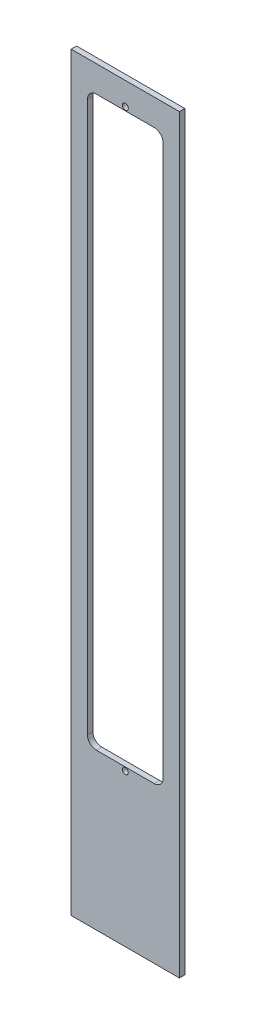
ISO-10303-21;
HEADER;
FILE_DESCRIPTION(('STEP AP214'),'2;1');
FILE_NAME('part.step','',(''),(''),'','','');
FILE_SCHEMA(('AUTOMOTIVE_DESIGN { 1 0 10303 214 1 1 1 1 }'));
ENDSEC;
DATA;
#1=APPLICATION_CONTEXT('core data for automotive mechanical design processes');
#2=APPLICATION_PROTOCOL_DEFINITION('international standard','automotive_design',2000,#1);
#3=PRODUCT_CONTEXT('',#1,'mechanical');
#4=PRODUCT('Part','Part','',(#3));
#5=PRODUCT_RELATED_PRODUCT_CATEGORY('part','',(#4));
#6=PRODUCT_DEFINITION_FORMATION('','',#4);
#7=PRODUCT_DEFINITION_CONTEXT('part definition',#1,'design');
#8=PRODUCT_DEFINITION('design','',#6,#7);
#9=PRODUCT_DEFINITION_SHAPE('','',#8);
#10=(LENGTH_UNIT() NAMED_UNIT(*) SI_UNIT(.MILLI.,.METRE.));
#11=(NAMED_UNIT(*) PLANE_ANGLE_UNIT() SI_UNIT($,.RADIAN.));
#12=(NAMED_UNIT(*) SI_UNIT($,.STERADIAN.) SOLID_ANGLE_UNIT());
#13=UNCERTAINTY_MEASURE_WITH_UNIT(LENGTH_MEASURE(1.E-05),#10,'distance_accuracy_value','');
#14=(GEOMETRIC_REPRESENTATION_CONTEXT(3) GLOBAL_UNCERTAINTY_ASSIGNED_CONTEXT((#13)) GLOBAL_UNIT_ASSIGNED_CONTEXT((#10,
#11,#12)) REPRESENTATION_CONTEXT('',''));
#15=CARTESIAN_POINT('',(0.,0.,0.));
#16=DIRECTION('',(0.,0.,1.));
#17=DIRECTION('',(1.,0.,0.));
#18=AXIS2_PLACEMENT_3D('',#15,#16,#17);
#19=CARTESIAN_POINT('',(60.,-416.,6.));
#20=DIRECTION('',(-1.,0.,0.));
#21=DIRECTION('',(0.,0.,1.));
#22=AXIS2_PLACEMENT_3D('',#19,#20,#21);
#23=PLANE('',#22);
#24=DIRECTION('',(0.,1.,0.));
#25=VECTOR('',#24,1.);
#26=CARTESIAN_POINT('',(60.,-416.,0.));
#27=LINE('',#26,#25);
#28=CARTESIAN_POINT('',(60.,-416.,0.));
#29=VERTEX_POINT('',#28);
#30=CARTESIAN_POINT('',(60.,416.,0.));
#31=VERTEX_POINT('',#30);
#32=EDGE_CURVE('E159',#29,#31,#27,.T.);
#33=ORIENTED_EDGE('',*,*,#32,.T.);
#34=DIRECTION('',(0.,0.,-1.));
#35=VECTOR('',#34,1.);
#36=CARTESIAN_POINT('',(60.,416.,6.));
#37=LINE('',#36,#35);
#38=CARTESIAN_POINT('',(60.,416.,6.));
#39=VERTEX_POINT('',#38);
#40=EDGE_CURVE('E196',#39,#31,#37,.T.);
#41=ORIENTED_EDGE('',*,*,#40,.F.);
#42=DIRECTION('',(0.,1.,0.));
#43=VECTOR('',#42,1.);
#44=CARTESIAN_POINT('',(60.,-416.,6.));
#45=LINE('',#44,#43);
#46=CARTESIAN_POINT('',(60.,-416.,6.));
#47=VERTEX_POINT('',#46);
#48=EDGE_CURVE('E170',#47,#39,#45,.T.);
#49=ORIENTED_EDGE('',*,*,#48,.F.);
#50=DIRECTION('',(0.,0.,-1.));
#51=VECTOR('',#50,1.);
#52=CARTESIAN_POINT('',(60.,-416.,6.));
#53=LINE('',#52,#51);
#54=EDGE_CURVE('E180',#47,#29,#53,.T.);
#55=ORIENTED_EDGE('',*,*,#54,.T.);
#56=EDGE_LOOP('',(#33,#41,#49,#55));
#57=FACE_BOUND('',#56,.T.);
#58=ADVANCED_FACE('F33',(#57),#23,.F.);
#59=CARTESIAN_POINT('',(-60.,416.,6.));
#60=DIRECTION('',(0.,-1.,0.));
#61=DIRECTION('',(0.,0.,-1.));
#62=AXIS2_PLACEMENT_3D('',#59,#60,#61);
#63=PLANE('',#62);
#64=DIRECTION('',(-1.,0.,0.));
#65=VECTOR('',#64,1.);
#66=CARTESIAN_POINT('',(-60.,416.,0.));
#67=LINE('',#66,#65);
#68=CARTESIAN_POINT('',(-60.,416.,0.));
#69=VERTEX_POINT('',#68);
#70=EDGE_CURVE('E183',#31,#69,#67,.T.);
#71=ORIENTED_EDGE('',*,*,#70,.T.);
#72=DIRECTION('',(0.,0.,-1.));
#73=VECTOR('',#72,1.);
#74=CARTESIAN_POINT('',(-60.,416.,6.));
#75=LINE('',#74,#73);
#76=CARTESIAN_POINT('',(-60.,416.,6.));
#77=VERTEX_POINT('',#76);
#78=EDGE_CURVE('E193',#77,#69,#75,.T.);
#79=ORIENTED_EDGE('',*,*,#78,.F.);
#80=DIRECTION('',(-1.,0.,0.));
#81=VECTOR('',#80,1.);
#82=CARTESIAN_POINT('',(-60.,416.,6.));
#83=LINE('',#82,#81);
#84=EDGE_CURVE('E173',#39,#77,#83,.T.);
#85=ORIENTED_EDGE('',*,*,#84,.F.);
#86=ORIENTED_EDGE('',*,*,#40,.T.);
#87=EDGE_LOOP('',(#71,#79,#85,#86));
#88=FACE_BOUND('',#87,.T.);
#89=ADVANCED_FACE('F270',(#88),#63,.F.);
#90=CARTESIAN_POINT('',(-60.,-416.,6.));
#91=DIRECTION('',(1.,0.,0.));
#92=DIRECTION('',(0.,0.,-1.));
#93=AXIS2_PLACEMENT_3D('',#90,#91,#92);
#94=PLANE('',#93);
#95=DIRECTION('',(0.,-1.,0.));
#96=VECTOR('',#95,1.);
#97=CARTESIAN_POINT('',(-60.,-416.,0.));
#98=LINE('',#97,#96);
#99=CARTESIAN_POINT('',(-60.,-416.,0.));
#100=VERTEX_POINT('',#99);
#101=EDGE_CURVE('E185',#69,#100,#98,.T.);
#102=ORIENTED_EDGE('',*,*,#101,.T.);
#103=DIRECTION('',(0.,0.,-1.));
#104=VECTOR('',#103,1.);
#105=CARTESIAN_POINT('',(-60.,-416.,6.));
#106=LINE('',#105,#104);
#107=CARTESIAN_POINT('',(-60.,-416.,6.));
#108=VERTEX_POINT('',#107);
#109=EDGE_CURVE('E190',#108,#100,#106,.T.);
#110=ORIENTED_EDGE('',*,*,#109,.F.);
#111=DIRECTION('',(0.,-1.,0.));
#112=VECTOR('',#111,1.);
#113=CARTESIAN_POINT('',(-60.,-416.,6.));
#114=LINE('',#113,#112);
#115=EDGE_CURVE('E176',#77,#108,#114,.T.);
#116=ORIENTED_EDGE('',*,*,#115,.F.);
#117=ORIENTED_EDGE('',*,*,#78,.T.);
#118=EDGE_LOOP('',(#102,#110,#116,#117));
#119=FACE_BOUND('',#118,.T.);
#120=ADVANCED_FACE('F275',(#119),#94,.F.);
#121=CARTESIAN_POINT('',(-60.,-416.,6.));
#122=DIRECTION('',(0.,1.,0.));
#123=DIRECTION('',(0.,0.,1.));
#124=AXIS2_PLACEMENT_3D('',#121,#122,#123);
#125=PLANE('',#124);
#126=DIRECTION('',(1.,0.,0.));
#127=VECTOR('',#126,1.);
#128=CARTESIAN_POINT('',(-60.,-416.,0.));
#129=LINE('',#128,#127);
#130=EDGE_CURVE('E174',#100,#29,#129,.T.);
#131=ORIENTED_EDGE('',*,*,#130,.T.);
#132=ORIENTED_EDGE('',*,*,#54,.F.);
#133=DIRECTION('',(1.,0.,0.));
#134=VECTOR('',#133,1.);
#135=CARTESIAN_POINT('',(-60.,-416.,6.));
#136=LINE('',#135,#134);
#137=EDGE_CURVE('E178',#108,#47,#136,.T.);
#138=ORIENTED_EDGE('',*,*,#137,.F.);
#139=ORIENTED_EDGE('',*,*,#109,.T.);
#140=EDGE_LOOP('',(#131,#132,#138,#139));
#141=FACE_BOUND('',#140,.T.);
#142=ADVANCED_FACE('F252',(#141),#125,.F.);
#143=CARTESIAN_POINT('',(0.,0.,6.));
#144=DIRECTION('',(0.,0.,-1.));
#145=DIRECTION('',(-1.,0.,0.));
#146=AXIS2_PLACEMENT_3D('',#143,#144,#145);
#147=PLANE('',#146);
#148=CARTESIAN_POINT('',(-7.6593306781399E-12,390.726304266074,6.));
#149=DIRECTION('',(0.,0.,1.));
#150=DIRECTION('',(1.,0.,0.));
#151=AXIS2_PLACEMENT_3D('',#148,#149,#150);
#152=CIRCLE('',#151,3.29999999999999);
#153=CARTESIAN_POINT('',(3.29999999999233,390.726304266074,6.));
#154=VERTEX_POINT('',#153);
#155=EDGE_CURVE('E244',#154,#154,#152,.T.);
#156=ORIENTED_EDGE('',*,*,#155,.F.);
#157=EDGE_LOOP('',(#156));
#158=FACE_BOUND('',#157,.T.);
#159=CARTESIAN_POINT('',(-2.21219712599296E-12,-247.273695733926,6.));
#160=DIRECTION('',(0.,0.,1.));
#161=DIRECTION('',(1.,0.,0.));
#162=AXIS2_PLACEMENT_3D('',#159,#160,#161);
#163=CIRCLE('',#162,3.29999999999999);
#164=CARTESIAN_POINT('',(3.29999999999778,-247.273695733926,6.));
#165=VERTEX_POINT('',#164);
#166=EDGE_CURVE('E236',#165,#165,#163,.T.);
#167=ORIENTED_EDGE('',*,*,#166,.F.);
#168=EDGE_LOOP('',(#167));
#169=FACE_BOUND('',#168,.T.);
#170=DIRECTION('',(0.,1.,0.));
#171=VECTOR('',#170,1.);
#172=CARTESIAN_POINT('',(41.9999999999917,376.726304266395,6.));
#173=LINE('',#172,#171);
#174=CARTESIAN_POINT('',(41.9999999999918,-233.273695733605,6.));
#175=VERTEX_POINT('',#174);
#176=CARTESIAN_POINT('',(41.9999999999917,376.726304266395,6.));
#177=VERTEX_POINT('',#176);
#178=EDGE_CURVE('E132',#175,#177,#173,.T.);
#179=ORIENTED_EDGE('',*,*,#178,.F.);
#180=CARTESIAN_POINT('',(31.9999999999918,-233.273695733605,6.));
#181=DIRECTION('',(0.,0.,1.));
#182=DIRECTION('',(-1.,0.,0.));
#183=AXIS2_PLACEMENT_3D('',#180,#181,#182);
#184=CIRCLE('',#183,10.);
#185=CARTESIAN_POINT('',(31.9999999999918,-243.273695733605,6.));
#186=VERTEX_POINT('',#185);
#187=EDGE_CURVE('E47',#186,#175,#184,.T.);
#188=ORIENTED_EDGE('',*,*,#187,.F.);
#189=DIRECTION('',(1.,0.,0.));
#190=VECTOR('',#189,1.);
#191=CARTESIAN_POINT('',(-32.0000000000028,-243.273695733605,6.));
#192=LINE('',#191,#190);
#193=CARTESIAN_POINT('',(-32.0000000000028,-243.273695733605,6.));
#194=VERTEX_POINT('',#193);
#195=EDGE_CURVE('E154',#194,#186,#192,.T.);
#196=ORIENTED_EDGE('',*,*,#195,.F.);
#197=CARTESIAN_POINT('',(-32.0000000000028,-233.273695733605,6.));
#198=DIRECTION('',(0.,0.,1.));
#199=DIRECTION('',(1.,0.,0.));
#200=AXIS2_PLACEMENT_3D('',#197,#198,#199);
#201=CIRCLE('',#200,10.);
#202=CARTESIAN_POINT('',(-42.0000000000028,-233.273695733605,6.));
#203=VERTEX_POINT('',#202);
#204=EDGE_CURVE('E151',#203,#194,#201,.T.);
#205=ORIENTED_EDGE('',*,*,#204,.F.);
#206=DIRECTION('',(0.,-1.,0.));
#207=VECTOR('',#206,1.);
#208=CARTESIAN_POINT('',(-42.0000000000029,376.726304266395,6.));
#209=LINE('',#208,#207);
#210=CARTESIAN_POINT('',(-42.0000000000029,376.726304266395,6.));
#211=VERTEX_POINT('',#210);
#212=EDGE_CURVE('E148',#211,#203,#209,.T.);
#213=ORIENTED_EDGE('',*,*,#212,.F.);
#214=CARTESIAN_POINT('',(-32.0000000000029,376.726304266395,6.));
#215=DIRECTION('',(0.,0.,1.));
#216=DIRECTION('',(1.,0.,0.));
#217=AXIS2_PLACEMENT_3D('',#214,#215,#216);
#218=CIRCLE('',#217,9.99999999999998);
#219=CARTESIAN_POINT('',(-32.0000000000029,386.726304266395,6.));
#220=VERTEX_POINT('',#219);
#221=EDGE_CURVE('E142',#220,#211,#218,.T.);
#222=ORIENTED_EDGE('',*,*,#221,.F.);
#223=DIRECTION('',(-1.,0.,0.));
#224=VECTOR('',#223,1.);
#225=CARTESIAN_POINT('',(-32.0000000000029,386.726304266395,6.));
#226=LINE('',#225,#224);
#227=CARTESIAN_POINT('',(31.9999999999917,386.726304266395,6.));
#228=VERTEX_POINT('',#227);
#229=EDGE_CURVE('E140',#228,#220,#226,.T.);
#230=ORIENTED_EDGE('',*,*,#229,.F.);
#231=CARTESIAN_POINT('',(31.9999999999917,376.726304266395,6.));
#232=DIRECTION('',(0.,0.,1.));
#233=DIRECTION('',(1.,0.,0.));
#234=AXIS2_PLACEMENT_3D('',#231,#232,#233);
#235=CIRCLE('',#234,9.99999999999998);
#236=EDGE_CURVE('E123',#177,#228,#235,.T.);
#237=ORIENTED_EDGE('',*,*,#236,.F.);
#238=EDGE_LOOP('',(#179,#188,#196,#205,#213,#222,#230,#237));
#239=FACE_BOUND('',#238,.T.);
#240=ORIENTED_EDGE('',*,*,#48,.T.);
#241=ORIENTED_EDGE('',*,*,#84,.T.);
#242=ORIENTED_EDGE('',*,*,#115,.T.);
#243=ORIENTED_EDGE('',*,*,#137,.T.);
#244=EDGE_LOOP('',(#240,#241,#242,#243));
#245=FACE_BOUND('',#244,.T.);
#246=ADVANCED_FACE('F136',(#158,#169,#239,#245),#147,.F.);
#247=CARTESIAN_POINT('',(0.,0.,0.));
#248=DIRECTION('',(0.,0.,-1.));
#249=DIRECTION('',(-1.,0.,0.));
#250=AXIS2_PLACEMENT_3D('',#247,#248,#249);
#251=PLANE('',#250);
#252=CARTESIAN_POINT('',(-7.6593306781399E-12,390.726304266074,0.));
#253=DIRECTION('',(0.,0.,1.));
#254=DIRECTION('',(1.,0.,0.));
#255=AXIS2_PLACEMENT_3D('',#252,#253,#254);
#256=CIRCLE('',#255,3.29999999999999);
#257=CARTESIAN_POINT('',(3.29999999999233,390.726304266074,0.));
#258=VERTEX_POINT('',#257);
#259=EDGE_CURVE('E241',#258,#258,#256,.T.);
#260=ORIENTED_EDGE('',*,*,#259,.T.);
#261=EDGE_LOOP('',(#260));
#262=FACE_BOUND('',#261,.T.);
#263=CARTESIAN_POINT('',(-2.21219712599296E-12,-247.273695733926,0.));
#264=DIRECTION('',(0.,0.,1.));
#265=DIRECTION('',(1.,0.,0.));
#266=AXIS2_PLACEMENT_3D('',#263,#264,#265);
#267=CIRCLE('',#266,3.29999999999999);
#268=CARTESIAN_POINT('',(3.29999999999777,-247.273695733926,0.));
#269=VERTEX_POINT('',#268);
#270=EDGE_CURVE('E234',#269,#269,#267,.T.);
#271=ORIENTED_EDGE('',*,*,#270,.T.);
#272=EDGE_LOOP('',(#271));
#273=FACE_BOUND('',#272,.T.);
#274=CARTESIAN_POINT('',(31.9999999999918,-233.273695733605,0.));
#275=DIRECTION('',(0.,0.,-1.));
#276=DIRECTION('',(-1.,0.,0.));
#277=AXIS2_PLACEMENT_3D('',#274,#275,#276);
#278=CIRCLE('',#277,10.);
#279=CARTESIAN_POINT('',(41.9999999999918,-233.273695733605,0.));
#280=VERTEX_POINT('',#279);
#281=CARTESIAN_POINT('',(31.9999999999918,-243.273695733605,0.));
#282=VERTEX_POINT('',#281);
#283=EDGE_CURVE('E11',#280,#282,#278,.T.);
#284=ORIENTED_EDGE('',*,*,#283,.F.);
#285=DIRECTION('',(0.,-1.,0.));
#286=VECTOR('',#285,1.);
#287=CARTESIAN_POINT('',(41.9999999999917,0.,0.));
#288=LINE('',#287,#286);
#289=CARTESIAN_POINT('',(41.9999999999917,376.726304266395,0.));
#290=VERTEX_POINT('',#289);
#291=EDGE_CURVE('E199',#290,#280,#288,.T.);
#292=ORIENTED_EDGE('',*,*,#291,.F.);
#293=CARTESIAN_POINT('',(31.9999999999917,376.726304266395,0.));
#294=DIRECTION('',(0.,0.,-1.));
#295=DIRECTION('',(-1.,0.,0.));
#296=AXIS2_PLACEMENT_3D('',#293,#294,#295);
#297=CIRCLE('',#296,9.99999999999998);
#298=CARTESIAN_POINT('',(31.9999999999917,386.726304266395,0.));
#299=VERTEX_POINT('',#298);
#300=EDGE_CURVE('E126',#299,#290,#297,.T.);
#301=ORIENTED_EDGE('',*,*,#300,.F.);
#302=DIRECTION('',(1.,0.,0.));
#303=VECTOR('',#302,1.);
#304=CARTESIAN_POINT('',(0.,386.726304266395,0.));
#305=LINE('',#304,#303);
#306=CARTESIAN_POINT('',(-32.0000000000029,386.726304266395,0.));
#307=VERTEX_POINT('',#306);
#308=EDGE_CURVE('E202',#307,#299,#305,.T.);
#309=ORIENTED_EDGE('',*,*,#308,.F.);
#310=CARTESIAN_POINT('',(-32.0000000000029,376.726304266395,0.));
#311=DIRECTION('',(0.,0.,-1.));
#312=DIRECTION('',(-1.,0.,0.));
#313=AXIS2_PLACEMENT_3D('',#310,#311,#312);
#314=CIRCLE('',#313,9.99999999999998);
#315=CARTESIAN_POINT('',(-42.0000000000029,376.726304266395,0.));
#316=VERTEX_POINT('',#315);
#317=EDGE_CURVE('E204',#316,#307,#314,.T.);
#318=ORIENTED_EDGE('',*,*,#317,.F.);
#319=DIRECTION('',(0.,1.,0.));
#320=VECTOR('',#319,1.);
#321=CARTESIAN_POINT('',(-42.0000000000029,0.,0.));
#322=LINE('',#321,#320);
#323=CARTESIAN_POINT('',(-42.0000000000028,-233.273695733605,0.));
#324=VERTEX_POINT('',#323);
#325=EDGE_CURVE('E206',#324,#316,#322,.T.);
#326=ORIENTED_EDGE('',*,*,#325,.F.);
#327=CARTESIAN_POINT('',(-32.0000000000028,-233.273695733605,0.));
#328=DIRECTION('',(0.,0.,-1.));
#329=DIRECTION('',(-1.,0.,0.));
#330=AXIS2_PLACEMENT_3D('',#327,#328,#329);
#331=CIRCLE('',#330,10.);
#332=CARTESIAN_POINT('',(-32.0000000000028,-243.273695733605,0.));
#333=VERTEX_POINT('',#332);
#334=EDGE_CURVE('E208',#333,#324,#331,.T.);
#335=ORIENTED_EDGE('',*,*,#334,.F.);
#336=DIRECTION('',(-1.,0.,0.));
#337=VECTOR('',#336,1.);
#338=CARTESIAN_POINT('',(1.0550314776919E-13,-243.273695733605,0.));
#339=LINE('',#338,#337);
#340=EDGE_CURVE('E40',#282,#333,#339,.T.);
#341=ORIENTED_EDGE('',*,*,#340,.F.);
#342=EDGE_LOOP('',(#284,#292,#301,#309,#318,#326,#335,#341));
#343=FACE_BOUND('',#342,.T.);
#344=ORIENTED_EDGE('',*,*,#32,.F.);
#345=ORIENTED_EDGE('',*,*,#130,.F.);
#346=ORIENTED_EDGE('',*,*,#101,.F.);
#347=ORIENTED_EDGE('',*,*,#70,.F.);
#348=EDGE_LOOP('',(#344,#345,#346,#347));
#349=FACE_BOUND('',#348,.T.);
#350=ADVANCED_FACE('F223',(#262,#273,#343,#349),#251,.T.);
#351=CARTESIAN_POINT('',(31.9999999999918,-233.273695733605,-4.));
#352=DIRECTION('',(0.,0.,1.));
#353=DIRECTION('',(1.,0.,0.));
#354=AXIS2_PLACEMENT_3D('',#351,#352,#353);
#355=CYLINDRICAL_SURFACE('',#354,10.);
#356=ORIENTED_EDGE('',*,*,#283,.T.);
#357=DIRECTION('',(0.,0.,1.));
#358=VECTOR('',#357,1.);
#359=CARTESIAN_POINT('',(31.9999999999918,-243.273695733605,-4.));
#360=LINE('',#359,#358);
#361=EDGE_CURVE('E157',#282,#186,#360,.T.);
#362=ORIENTED_EDGE('',*,*,#361,.T.);
#363=ORIENTED_EDGE('',*,*,#187,.T.);
#364=DIRECTION('',(0.,0.,1.));
#365=VECTOR('',#364,1.);
#366=CARTESIAN_POINT('',(41.9999999999918,-233.273695733605,-4.));
#367=LINE('',#366,#365);
#368=EDGE_CURVE('E129',#280,#175,#367,.T.);
#369=ORIENTED_EDGE('',*,*,#368,.F.);
#370=EDGE_LOOP('',(#356,#362,#363,#369));
#371=FACE_BOUND('',#370,.T.);
#372=ADVANCED_FACE('F297',(#371),#355,.F.);
#373=CARTESIAN_POINT('',(-32.0000000000028,-243.273695733605,-4.));
#374=DIRECTION('',(0.,-1.,0.));
#375=DIRECTION('',(1.,0.,0.));
#376=AXIS2_PLACEMENT_3D('',#373,#374,#375);
#377=PLANE('',#376);
#378=ORIENTED_EDGE('',*,*,#340,.T.);
#379=DIRECTION('',(0.,0.,1.));
#380=VECTOR('',#379,1.);
#381=CARTESIAN_POINT('',(-32.0000000000028,-243.273695733605,-4.));
#382=LINE('',#381,#380);
#383=EDGE_CURVE('E160',#333,#194,#382,.T.);
#384=ORIENTED_EDGE('',*,*,#383,.T.);
#385=ORIENTED_EDGE('',*,*,#195,.T.);
#386=ORIENTED_EDGE('',*,*,#361,.F.);
#387=EDGE_LOOP('',(#378,#384,#385,#386));
#388=FACE_BOUND('',#387,.T.);
#389=ADVANCED_FACE('F213',(#388),#377,.F.);
#390=CARTESIAN_POINT('',(-32.0000000000028,-233.273695733605,-4.));
#391=DIRECTION('',(0.,0.,1.));
#392=DIRECTION('',(1.,0.,0.));
#393=AXIS2_PLACEMENT_3D('',#390,#391,#392);
#394=CYLINDRICAL_SURFACE('',#393,10.);
#395=ORIENTED_EDGE('',*,*,#334,.T.);
#396=DIRECTION('',(0.,0.,1.));
#397=VECTOR('',#396,1.);
#398=CARTESIAN_POINT('',(-42.0000000000028,-233.273695733605,-4.));
#399=LINE('',#398,#397);
#400=EDGE_CURVE('E162',#324,#203,#399,.T.);
#401=ORIENTED_EDGE('',*,*,#400,.T.);
#402=ORIENTED_EDGE('',*,*,#204,.T.);
#403=ORIENTED_EDGE('',*,*,#383,.F.);
#404=EDGE_LOOP('',(#395,#401,#402,#403));
#405=FACE_BOUND('',#404,.T.);
#406=ADVANCED_FACE('F218',(#405),#394,.F.);
#407=CARTESIAN_POINT('',(-42.0000000000029,376.726304266395,-4.));
#408=DIRECTION('',(-1.,0.,0.));
#409=DIRECTION('',(0.,-1.,0.));
#410=AXIS2_PLACEMENT_3D('',#407,#408,#409);
#411=PLANE('',#410);
#412=ORIENTED_EDGE('',*,*,#325,.T.);
#413=DIRECTION('',(0.,0.,1.));
#414=VECTOR('',#413,1.);
#415=CARTESIAN_POINT('',(-42.0000000000029,376.726304266395,-4.));
#416=LINE('',#415,#414);
#417=EDGE_CURVE('E164',#316,#211,#416,.T.);
#418=ORIENTED_EDGE('',*,*,#417,.T.);
#419=ORIENTED_EDGE('',*,*,#212,.T.);
#420=ORIENTED_EDGE('',*,*,#400,.F.);
#421=EDGE_LOOP('',(#412,#418,#419,#420));
#422=FACE_BOUND('',#421,.T.);
#423=ADVANCED_FACE('F229',(#422),#411,.F.);
#424=CARTESIAN_POINT('',(-32.0000000000029,376.726304266395,-4.));
#425=DIRECTION('',(0.,0.,1.));
#426=DIRECTION('',(1.,0.,0.));
#427=AXIS2_PLACEMENT_3D('',#424,#425,#426);
#428=CYLINDRICAL_SURFACE('',#427,9.99999999999998);
#429=ORIENTED_EDGE('',*,*,#317,.T.);
#430=DIRECTION('',(0.,0.,1.));
#431=VECTOR('',#430,1.);
#432=CARTESIAN_POINT('',(-32.0000000000029,386.726304266395,-4.));
#433=LINE('',#432,#431);
#434=EDGE_CURVE('E166',#307,#220,#433,.T.);
#435=ORIENTED_EDGE('',*,*,#434,.T.);
#436=ORIENTED_EDGE('',*,*,#221,.T.);
#437=ORIENTED_EDGE('',*,*,#417,.F.);
#438=EDGE_LOOP('',(#429,#435,#436,#437));
#439=FACE_BOUND('',#438,.T.);
#440=ADVANCED_FACE('F231',(#439),#428,.F.);
#441=CARTESIAN_POINT('',(-32.0000000000029,386.726304266395,-4.));
#442=DIRECTION('',(0.,1.,0.));
#443=DIRECTION('',(0.,0.,1.));
#444=AXIS2_PLACEMENT_3D('',#441,#442,#443);
#445=PLANE('',#444);
#446=ORIENTED_EDGE('',*,*,#308,.T.);
#447=DIRECTION('',(0.,0.,1.));
#448=VECTOR('',#447,1.);
#449=CARTESIAN_POINT('',(31.9999999999917,386.726304266395,-4.));
#450=LINE('',#449,#448);
#451=EDGE_CURVE('E128',#299,#228,#450,.T.);
#452=ORIENTED_EDGE('',*,*,#451,.T.);
#453=ORIENTED_EDGE('',*,*,#229,.T.);
#454=ORIENTED_EDGE('',*,*,#434,.F.);
#455=EDGE_LOOP('',(#446,#452,#453,#454));
#456=FACE_BOUND('',#455,.T.);
#457=ADVANCED_FACE('F304',(#456),#445,.F.);
#458=CARTESIAN_POINT('',(31.9999999999917,376.726304266395,-4.));
#459=DIRECTION('',(0.,0.,1.));
#460=DIRECTION('',(1.,0.,0.));
#461=AXIS2_PLACEMENT_3D('',#458,#459,#460);
#462=CYLINDRICAL_SURFACE('',#461,9.99999999999998);
#463=ORIENTED_EDGE('',*,*,#300,.T.);
#464=DIRECTION('',(0.,0.,1.));
#465=VECTOR('',#464,1.);
#466=CARTESIAN_POINT('',(41.9999999999917,376.726304266395,-4.));
#467=LINE('',#466,#465);
#468=EDGE_CURVE('E55',#290,#177,#467,.T.);
#469=ORIENTED_EDGE('',*,*,#468,.T.);
#470=ORIENTED_EDGE('',*,*,#236,.T.);
#471=ORIENTED_EDGE('',*,*,#451,.F.);
#472=EDGE_LOOP('',(#463,#469,#470,#471));
#473=FACE_BOUND('',#472,.T.);
#474=ADVANCED_FACE('F120',(#473),#462,.F.);
#475=CARTESIAN_POINT('',(41.9999999999917,376.726304266395,-4.));
#476=DIRECTION('',(1.,0.,0.));
#477=DIRECTION('',(0.,1.,0.));
#478=AXIS2_PLACEMENT_3D('',#475,#476,#477);
#479=PLANE('',#478);
#480=ORIENTED_EDGE('',*,*,#291,.T.);
#481=ORIENTED_EDGE('',*,*,#368,.T.);
#482=ORIENTED_EDGE('',*,*,#178,.T.);
#483=ORIENTED_EDGE('',*,*,#468,.F.);
#484=EDGE_LOOP('',(#480,#481,#482,#483));
#485=FACE_BOUND('',#484,.T.);
#486=ADVANCED_FACE('F133',(#485),#479,.F.);
#487=CARTESIAN_POINT('',(-2.21219712599296E-12,-247.273695733926,6.));
#488=DIRECTION('',(0.,0.,1.));
#489=DIRECTION('',(1.,0.,0.));
#490=AXIS2_PLACEMENT_3D('',#487,#488,#489);
#491=CYLINDRICAL_SURFACE('',#490,3.29999999999999);
#492=ORIENTED_EDGE('',*,*,#270,.F.);
#493=EDGE_LOOP('',(#492));
#494=FACE_BOUND('',#493,.T.);
#495=ORIENTED_EDGE('',*,*,#166,.T.);
#496=EDGE_LOOP('',(#495));
#497=FACE_BOUND('',#496,.T.);
#498=ADVANCED_FACE('F256',(#494,#497),#491,.F.);
#499=CARTESIAN_POINT('',(-7.6593306781399E-12,390.726304266074,6.));
#500=DIRECTION('',(0.,0.,1.));
#501=DIRECTION('',(1.,0.,0.));
#502=AXIS2_PLACEMENT_3D('',#499,#500,#501);
#503=CYLINDRICAL_SURFACE('',#502,3.29999999999999);
#504=ORIENTED_EDGE('',*,*,#259,.F.);
#505=EDGE_LOOP('',(#504));
#506=FACE_BOUND('',#505,.T.);
#507=ORIENTED_EDGE('',*,*,#155,.T.);
#508=EDGE_LOOP('',(#507));
#509=FACE_BOUND('',#508,.T.);
#510=ADVANCED_FACE('F248',(#506,#509),#503,.F.);
#511=CLOSED_SHELL('',(#58,#89,#120,#142,#246,#350,#372,#389,#406,#423,#440,#457,#474,#486,#498,#510));
#512=MANIFOLD_SOLID_BREP('B2',#511);
#513=ADVANCED_BREP_SHAPE_REPRESENTATION('',(#18,#512),#14);
#514=SHAPE_DEFINITION_REPRESENTATION(#9,#513);
ENDSEC;
END-ISO-10303-21;
